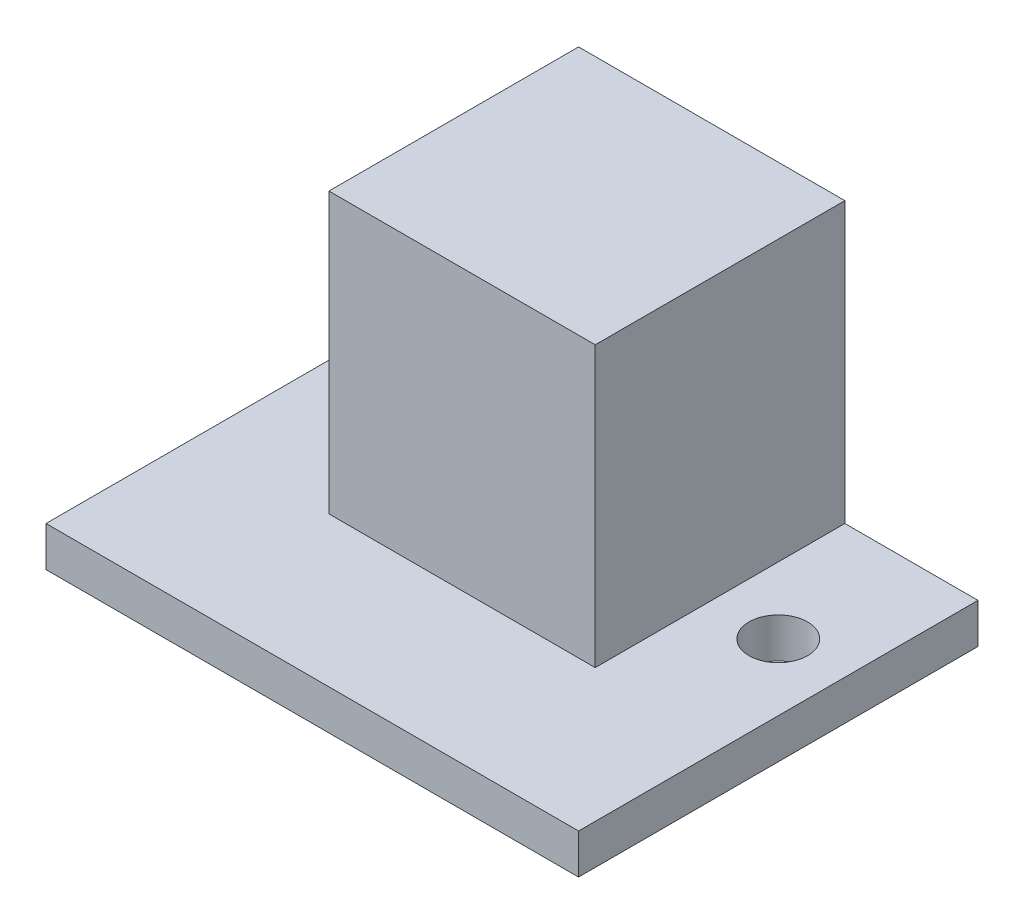
ISO-10303-21;
HEADER;
FILE_DESCRIPTION(('STEP AP214'),'2;1');
FILE_NAME('part.step','',(''),(''),'','','');
FILE_SCHEMA(('AUTOMOTIVE_DESIGN { 1 0 10303 214 1 1 1 1 }'));
ENDSEC;
DATA;
#1=APPLICATION_CONTEXT('core data for automotive mechanical design processes');
#2=APPLICATION_PROTOCOL_DEFINITION('international standard','automotive_design',2000,#1);
#3=PRODUCT_CONTEXT('',#1,'mechanical');
#4=PRODUCT('Part','Part','',(#3));
#5=PRODUCT_RELATED_PRODUCT_CATEGORY('part','',(#4));
#6=PRODUCT_DEFINITION_FORMATION('','',#4);
#7=PRODUCT_DEFINITION_CONTEXT('part definition',#1,'design');
#8=PRODUCT_DEFINITION('design','',#6,#7);
#9=PRODUCT_DEFINITION_SHAPE('','',#8);
#10=(LENGTH_UNIT() NAMED_UNIT(*) SI_UNIT(.MILLI.,.METRE.));
#11=(NAMED_UNIT(*) PLANE_ANGLE_UNIT() SI_UNIT($,.RADIAN.));
#12=(NAMED_UNIT(*) SI_UNIT($,.STERADIAN.) SOLID_ANGLE_UNIT());
#13=UNCERTAINTY_MEASURE_WITH_UNIT(LENGTH_MEASURE(1.E-05),#10,'distance_accuracy_value','');
#14=(GEOMETRIC_REPRESENTATION_CONTEXT(3) GLOBAL_UNCERTAINTY_ASSIGNED_CONTEXT((#13)) GLOBAL_UNIT_ASSIGNED_CONTEXT((#10,
#11,#12)) REPRESENTATION_CONTEXT('',''));
#15=CARTESIAN_POINT('',(0.,0.,0.));
#16=DIRECTION('',(0.,0.,1.));
#17=DIRECTION('',(1.,0.,0.));
#18=AXIS2_PLACEMENT_3D('',#15,#16,#17);
#19=CARTESIAN_POINT('',(0.,3.,-15.6296512348422));
#20=DIRECTION('',(0.,0.,-1.));
#21=DIRECTION('',(-1.,0.,0.));
#22=AXIS2_PLACEMENT_3D('',#19,#20,#21);
#23=PLANE('',#22);
#24=DIRECTION('',(1.,0.,0.));
#25=VECTOR('',#24,1.);
#26=CARTESIAN_POINT('',(0.,0.,-15.6296512348422));
#27=LINE('',#26,#25);
#28=CARTESIAN_POINT('',(-20.051649439755,0.,-15.6296512348422));
#29=VERTEX_POINT('',#28);
#30=CARTESIAN_POINT('',(19.948350560245,0.,-15.6296512348422));
#31=VERTEX_POINT('',#30);
#32=EDGE_CURVE('E137',#29,#31,#27,.T.);
#33=ORIENTED_EDGE('',*,*,#32,.F.);
#34=DIRECTION('',(0.,-1.,0.));
#35=VECTOR('',#34,1.);
#36=CARTESIAN_POINT('',(-20.051649439755,3.,-15.6296512348422));
#37=LINE('',#36,#35);
#38=CARTESIAN_POINT('',(-20.051649439755,3.,-15.6296512348422));
#39=VERTEX_POINT('',#38);
#40=EDGE_CURVE('E11',#39,#29,#37,.T.);
#41=ORIENTED_EDGE('',*,*,#40,.F.);
#42=DIRECTION('',(1.,0.,0.));
#43=VECTOR('',#42,1.);
#44=CARTESIAN_POINT('',(0.,3.,-15.6296512348422));
#45=LINE('',#44,#43);
#46=CARTESIAN_POINT('',(-10.051649439755,3.,-15.6296512348422));
#47=VERTEX_POINT('',#46);
#48=EDGE_CURVE('E138',#39,#47,#45,.T.);
#49=ORIENTED_EDGE('',*,*,#48,.T.);
#50=DIRECTION('',(0.,-1.,0.));
#51=VECTOR('',#50,1.);
#52=CARTESIAN_POINT('',(-10.051649439755,20.,-15.6296512348422));
#53=LINE('',#52,#51);
#54=CARTESIAN_POINT('',(-10.051649439755,24.,-15.6296512348422));
#55=VERTEX_POINT('',#54);
#56=EDGE_CURVE('E112',#55,#47,#53,.T.);
#57=ORIENTED_EDGE('',*,*,#56,.F.);
#58=DIRECTION('',(-1.,0.,0.));
#59=VECTOR('',#58,1.);
#60=CARTESIAN_POINT('',(-10.051649439755,24.,-15.6296512348422));
#61=LINE('',#60,#59);
#62=CARTESIAN_POINT('',(9.94835056024496,24.,-15.6296512348422));
#63=VERTEX_POINT('',#62);
#64=EDGE_CURVE('E115',#63,#55,#61,.T.);
#65=ORIENTED_EDGE('',*,*,#64,.F.);
#66=DIRECTION('',(0.,-1.,0.));
#67=VECTOR('',#66,1.);
#68=CARTESIAN_POINT('',(9.94835056024496,20.,-15.6296512348422));
#69=LINE('',#68,#67);
#70=CARTESIAN_POINT('',(9.94835056024496,3.,-15.6296512348422));
#71=VERTEX_POINT('',#70);
#72=EDGE_CURVE('E104',#63,#71,#69,.T.);
#73=ORIENTED_EDGE('',*,*,#72,.T.);
#74=CARTESIAN_POINT('',(19.948350560245,3.,-15.6296512348422));
#75=VERTEX_POINT('',#74);
#76=EDGE_CURVE('E58',#71,#75,#45,.T.);
#77=ORIENTED_EDGE('',*,*,#76,.T.);
#78=DIRECTION('',(0.,-1.,0.));
#79=VECTOR('',#78,1.);
#80=CARTESIAN_POINT('',(19.948350560245,3.,-15.6296512348422));
#81=LINE('',#80,#79);
#82=EDGE_CURVE('E76',#75,#31,#81,.T.);
#83=ORIENTED_EDGE('',*,*,#82,.T.);
#84=EDGE_LOOP('',(#33,#41,#49,#57,#65,#73,#77,#83));
#85=FACE_BOUND('',#84,.T.);
#86=ADVANCED_FACE('F35',(#85),#23,.T.);
#87=CARTESIAN_POINT('',(-20.051649439755,3.,0.));
#88=DIRECTION('',(1.,0.,0.));
#89=DIRECTION('',(0.,0.,-1.));
#90=AXIS2_PLACEMENT_3D('',#87,#88,#89);
#91=PLANE('',#90);
#92=DIRECTION('',(0.,0.,1.));
#93=VECTOR('',#92,1.);
#94=CARTESIAN_POINT('',(-20.051649439755,0.,0.));
#95=LINE('',#94,#93);
#96=CARTESIAN_POINT('',(-20.051649439755,0.,14.3703487651578));
#97=VERTEX_POINT('',#96);
#98=EDGE_CURVE('E154',#29,#97,#95,.T.);
#99=ORIENTED_EDGE('',*,*,#98,.T.);
#100=DIRECTION('',(0.,-1.,0.));
#101=VECTOR('',#100,1.);
#102=CARTESIAN_POINT('',(-20.051649439755,3.,14.3703487651578));
#103=LINE('',#102,#101);
#104=CARTESIAN_POINT('',(-20.051649439755,3.,14.3703487651578));
#105=VERTEX_POINT('',#104);
#106=EDGE_CURVE('E42',#105,#97,#103,.T.);
#107=ORIENTED_EDGE('',*,*,#106,.F.);
#108=DIRECTION('',(0.,0.,1.));
#109=VECTOR('',#108,1.);
#110=CARTESIAN_POINT('',(-20.051649439755,3.,0.));
#111=LINE('',#110,#109);
#112=EDGE_CURVE('E140',#39,#105,#111,.T.);
#113=ORIENTED_EDGE('',*,*,#112,.F.);
#114=ORIENTED_EDGE('',*,*,#40,.T.);
#115=EDGE_LOOP('',(#99,#107,#113,#114));
#116=FACE_BOUND('',#115,.T.);
#117=ADVANCED_FACE('F191',(#116),#91,.F.);
#118=CARTESIAN_POINT('',(0.,3.,14.3703487651578));
#119=DIRECTION('',(0.,0.,-1.));
#120=DIRECTION('',(-1.,0.,0.));
#121=AXIS2_PLACEMENT_3D('',#118,#119,#120);
#122=PLANE('',#121);
#123=DIRECTION('',(1.,0.,0.));
#124=VECTOR('',#123,1.);
#125=CARTESIAN_POINT('',(0.,0.,14.3703487651578));
#126=LINE('',#125,#124);
#127=CARTESIAN_POINT('',(19.948350560245,0.,14.3703487651578));
#128=VERTEX_POINT('',#127);
#129=EDGE_CURVE('E156',#97,#128,#126,.T.);
#130=ORIENTED_EDGE('',*,*,#129,.T.);
#131=DIRECTION('',(0.,-1.,0.));
#132=VECTOR('',#131,1.);
#133=CARTESIAN_POINT('',(19.948350560245,3.,14.3703487651578));
#134=LINE('',#133,#132);
#135=CARTESIAN_POINT('',(19.948350560245,3.,14.3703487651578));
#136=VERTEX_POINT('',#135);
#137=EDGE_CURVE('E169',#136,#128,#134,.T.);
#138=ORIENTED_EDGE('',*,*,#137,.F.);
#139=DIRECTION('',(1.,0.,0.));
#140=VECTOR('',#139,1.);
#141=CARTESIAN_POINT('',(0.,3.,14.3703487651578));
#142=LINE('',#141,#140);
#143=EDGE_CURVE('E142',#105,#136,#142,.T.);
#144=ORIENTED_EDGE('',*,*,#143,.F.);
#145=ORIENTED_EDGE('',*,*,#106,.T.);
#146=EDGE_LOOP('',(#130,#138,#144,#145));
#147=FACE_BOUND('',#146,.T.);
#148=ADVANCED_FACE('F175',(#147),#122,.F.);
#149=CARTESIAN_POINT('',(-15.051649439755,3.,-5.62965123484221));
#150=DIRECTION('',(0.,-1.,0.));
#151=DIRECTION('',(0.,0.,-1.));
#152=AXIS2_PLACEMENT_3D('',#149,#150,#151);
#153=CYLINDRICAL_SURFACE('',#152,2.2);
#154=CARTESIAN_POINT('',(-15.051649439755,3.,-5.62965123484221));
#155=DIRECTION('',(0.,1.,0.));
#156=DIRECTION('',(0.,0.,1.));
#157=AXIS2_PLACEMENT_3D('',#154,#155,#156);
#158=CIRCLE('',#157,2.2);
#159=CARTESIAN_POINT('',(-15.051649439755,3.,-3.42965123484221));
#160=VERTEX_POINT('',#159);
#161=EDGE_CURVE('E147',#160,#160,#158,.T.);
#162=ORIENTED_EDGE('',*,*,#161,.T.);
#163=EDGE_LOOP('',(#162));
#164=FACE_BOUND('',#163,.T.);
#165=CARTESIAN_POINT('',(-15.051649439755,0.,-5.62965123484221));
#166=DIRECTION('',(0.,1.,0.));
#167=DIRECTION('',(0.,0.,1.));
#168=AXIS2_PLACEMENT_3D('',#165,#166,#167);
#169=CIRCLE('',#168,2.2);
#170=CARTESIAN_POINT('',(-15.051649439755,0.,-3.42965123484221));
#171=VERTEX_POINT('',#170);
#172=EDGE_CURVE('E162',#171,#171,#169,.T.);
#173=ORIENTED_EDGE('',*,*,#172,.F.);
#174=EDGE_LOOP('',(#173));
#175=FACE_BOUND('',#174,.T.);
#176=ADVANCED_FACE('F197',(#164,#175),#153,.F.);
#177=CARTESIAN_POINT('',(19.948350560245,3.,0.));
#178=DIRECTION('',(1.,0.,0.));
#179=DIRECTION('',(0.,0.,-1.));
#180=AXIS2_PLACEMENT_3D('',#177,#178,#179);
#181=PLANE('',#180);
#182=DIRECTION('',(0.,0.,1.));
#183=VECTOR('',#182,1.);
#184=CARTESIAN_POINT('',(19.948350560245,0.,0.));
#185=LINE('',#184,#183);
#186=EDGE_CURVE('E159',#31,#128,#185,.T.);
#187=ORIENTED_EDGE('',*,*,#186,.F.);
#188=ORIENTED_EDGE('',*,*,#82,.F.);
#189=DIRECTION('',(0.,0.,1.));
#190=VECTOR('',#189,1.);
#191=CARTESIAN_POINT('',(19.948350560245,3.,0.));
#192=LINE('',#191,#190);
#193=EDGE_CURVE('E144',#75,#136,#192,.T.);
#194=ORIENTED_EDGE('',*,*,#193,.T.);
#195=ORIENTED_EDGE('',*,*,#137,.T.);
#196=EDGE_LOOP('',(#187,#188,#194,#195));
#197=FACE_BOUND('',#196,.T.);
#198=ADVANCED_FACE('F184',(#197),#181,.T.);
#199=CARTESIAN_POINT('',(14.948350560245,3.,-5.62965123484221));
#200=DIRECTION('',(0.,-1.,0.));
#201=DIRECTION('',(0.,0.,-1.));
#202=AXIS2_PLACEMENT_3D('',#199,#200,#201);
#203=CYLINDRICAL_SURFACE('',#202,2.2);
#204=CARTESIAN_POINT('',(14.948350560245,3.,-5.62965123484221));
#205=DIRECTION('',(0.,1.,0.));
#206=DIRECTION('',(0.,0.,1.));
#207=AXIS2_PLACEMENT_3D('',#204,#205,#206);
#208=CIRCLE('',#207,2.2);
#209=CARTESIAN_POINT('',(14.948350560245,3.,-3.42965123484221));
#210=VERTEX_POINT('',#209);
#211=EDGE_CURVE('E150',#210,#210,#208,.T.);
#212=ORIENTED_EDGE('',*,*,#211,.T.);
#213=EDGE_LOOP('',(#212));
#214=FACE_BOUND('',#213,.T.);
#215=CARTESIAN_POINT('',(14.948350560245,0.,-5.62965123484221));
#216=DIRECTION('',(0.,1.,0.));
#217=DIRECTION('',(0.,0.,1.));
#218=AXIS2_PLACEMENT_3D('',#215,#216,#217);
#219=CIRCLE('',#218,2.2);
#220=CARTESIAN_POINT('',(14.948350560245,0.,-3.42965123484221));
#221=VERTEX_POINT('',#220);
#222=EDGE_CURVE('E165',#221,#221,#219,.T.);
#223=ORIENTED_EDGE('',*,*,#222,.F.);
#224=EDGE_LOOP('',(#223));
#225=FACE_BOUND('',#224,.T.);
#226=ADVANCED_FACE('F202',(#214,#225),#203,.F.);
#227=CARTESIAN_POINT('',(0.,3.,0.));
#228=DIRECTION('',(0.,1.,0.));
#229=DIRECTION('',(0.,0.,1.));
#230=AXIS2_PLACEMENT_3D('',#227,#228,#229);
#231=PLANE('',#230);
#232=DIRECTION('',(0.,0.,1.));
#233=VECTOR('',#232,1.);
#234=CARTESIAN_POINT('',(-10.051649439755,3.,0.));
#235=LINE('',#234,#233);
#236=CARTESIAN_POINT('',(-10.051649439755,3.,3.12034876515778));
#237=VERTEX_POINT('',#236);
#238=EDGE_CURVE('E131',#47,#237,#235,.T.);
#239=ORIENTED_EDGE('',*,*,#238,.F.);
#240=ORIENTED_EDGE('',*,*,#48,.F.);
#241=ORIENTED_EDGE('',*,*,#112,.T.);
#242=ORIENTED_EDGE('',*,*,#143,.T.);
#243=ORIENTED_EDGE('',*,*,#193,.F.);
#244=ORIENTED_EDGE('',*,*,#76,.F.);
#245=DIRECTION('',(0.,0.,1.));
#246=VECTOR('',#245,1.);
#247=CARTESIAN_POINT('',(9.94835056024495,3.,0.));
#248=LINE('',#247,#246);
#249=CARTESIAN_POINT('',(9.94835056024495,3.,3.12034876515778));
#250=VERTEX_POINT('',#249);
#251=EDGE_CURVE('E110',#71,#250,#248,.T.);
#252=ORIENTED_EDGE('',*,*,#251,.T.);
#253=DIRECTION('',(1.,0.,0.));
#254=VECTOR('',#253,1.);
#255=CARTESIAN_POINT('',(0.,3.,3.12034876515778));
#256=LINE('',#255,#254);
#257=EDGE_CURVE('E49',#237,#250,#256,.T.);
#258=ORIENTED_EDGE('',*,*,#257,.F.);
#259=EDGE_LOOP('',(#239,#240,#241,#242,#243,#244,#252,#258));
#260=FACE_BOUND('',#259,.T.);
#261=ORIENTED_EDGE('',*,*,#161,.F.);
#262=EDGE_LOOP('',(#261));
#263=FACE_BOUND('',#262,.T.);
#264=ORIENTED_EDGE('',*,*,#211,.F.);
#265=EDGE_LOOP('',(#264));
#266=FACE_BOUND('',#265,.T.);
#267=ADVANCED_FACE('F188',(#260,#263,#266),#231,.T.);
#268=CARTESIAN_POINT('',(0.,0.,0.));
#269=DIRECTION('',(0.,1.,0.));
#270=DIRECTION('',(0.,0.,1.));
#271=AXIS2_PLACEMENT_3D('',#268,#269,#270);
#272=PLANE('',#271);
#273=ORIENTED_EDGE('',*,*,#32,.T.);
#274=ORIENTED_EDGE('',*,*,#186,.T.);
#275=ORIENTED_EDGE('',*,*,#129,.F.);
#276=ORIENTED_EDGE('',*,*,#98,.F.);
#277=EDGE_LOOP('',(#273,#274,#275,#276));
#278=FACE_BOUND('',#277,.T.);
#279=ORIENTED_EDGE('',*,*,#172,.T.);
#280=EDGE_LOOP('',(#279));
#281=FACE_BOUND('',#280,.T.);
#282=ORIENTED_EDGE('',*,*,#222,.T.);
#283=EDGE_LOOP('',(#282));
#284=FACE_BOUND('',#283,.T.);
#285=ADVANCED_FACE('F180',(#278,#281,#284),#272,.F.);
#286=CARTESIAN_POINT('',(0.,20.,3.12034876515778));
#287=DIRECTION('',(0.,0.,-1.));
#288=DIRECTION('',(-1.,0.,0.));
#289=AXIS2_PLACEMENT_3D('',#286,#287,#288);
#290=PLANE('',#289);
#291=ORIENTED_EDGE('',*,*,#257,.T.);
#292=DIRECTION('',(0.,-1.,0.));
#293=VECTOR('',#292,1.);
#294=CARTESIAN_POINT('',(9.94835056024495,20.,3.12034876515778));
#295=LINE('',#294,#293);
#296=CARTESIAN_POINT('',(9.94835056024495,24.,3.12034876515778));
#297=VERTEX_POINT('',#296);
#298=EDGE_CURVE('E111',#297,#250,#295,.T.);
#299=ORIENTED_EDGE('',*,*,#298,.F.);
#300=DIRECTION('',(1.,0.,0.));
#301=VECTOR('',#300,1.);
#302=CARTESIAN_POINT('',(9.94835056024495,24.,3.12034876515778));
#303=LINE('',#302,#301);
#304=CARTESIAN_POINT('',(-10.051649439755,24.,3.12034876515778));
#305=VERTEX_POINT('',#304);
#306=EDGE_CURVE('E124',#305,#297,#303,.T.);
#307=ORIENTED_EDGE('',*,*,#306,.F.);
#308=DIRECTION('',(0.,-1.,0.));
#309=VECTOR('',#308,1.);
#310=CARTESIAN_POINT('',(-10.051649439755,20.,3.12034876515778));
#311=LINE('',#310,#309);
#312=EDGE_CURVE('E133',#305,#237,#311,.T.);
#313=ORIENTED_EDGE('',*,*,#312,.T.);
#314=EDGE_LOOP('',(#291,#299,#307,#313));
#315=FACE_BOUND('',#314,.T.);
#316=ADVANCED_FACE('F211',(#315),#290,.F.);
#317=CARTESIAN_POINT('',(9.94835056024495,20.,0.));
#318=DIRECTION('',(1.,0.,0.));
#319=DIRECTION('',(0.,0.,-1.));
#320=AXIS2_PLACEMENT_3D('',#317,#318,#319);
#321=PLANE('',#320);
#322=ORIENTED_EDGE('',*,*,#251,.F.);
#323=ORIENTED_EDGE('',*,*,#72,.F.);
#324=DIRECTION('',(0.,0.,-1.));
#325=VECTOR('',#324,1.);
#326=CARTESIAN_POINT('',(9.94835056024496,24.,-15.6296512348422));
#327=LINE('',#326,#325);
#328=EDGE_CURVE('E108',#297,#63,#327,.T.);
#329=ORIENTED_EDGE('',*,*,#328,.F.);
#330=ORIENTED_EDGE('',*,*,#298,.T.);
#331=EDGE_LOOP('',(#322,#323,#329,#330));
#332=FACE_BOUND('',#331,.T.);
#333=ADVANCED_FACE('F106',(#332),#321,.T.);
#334=CARTESIAN_POINT('',(-10.051649439755,20.,0.));
#335=DIRECTION('',(1.,0.,0.));
#336=DIRECTION('',(0.,0.,-1.));
#337=AXIS2_PLACEMENT_3D('',#334,#335,#336);
#338=PLANE('',#337);
#339=ORIENTED_EDGE('',*,*,#238,.T.);
#340=ORIENTED_EDGE('',*,*,#312,.F.);
#341=DIRECTION('',(0.,0.,1.));
#342=VECTOR('',#341,1.);
#343=CARTESIAN_POINT('',(-10.051649439755,24.,3.12034876515778));
#344=LINE('',#343,#342);
#345=EDGE_CURVE('E119',#55,#305,#344,.T.);
#346=ORIENTED_EDGE('',*,*,#345,.F.);
#347=ORIENTED_EDGE('',*,*,#56,.T.);
#348=EDGE_LOOP('',(#339,#340,#346,#347));
#349=FACE_BOUND('',#348,.T.);
#350=ADVANCED_FACE('F218',(#349),#338,.F.);
#351=CARTESIAN_POINT('',(0.,24.,0.));
#352=DIRECTION('',(0.,-1.,0.));
#353=DIRECTION('',(0.,0.,-1.));
#354=AXIS2_PLACEMENT_3D('',#351,#352,#353);
#355=PLANE('',#354);
#356=ORIENTED_EDGE('',*,*,#328,.T.);
#357=ORIENTED_EDGE('',*,*,#64,.T.);
#358=ORIENTED_EDGE('',*,*,#345,.T.);
#359=ORIENTED_EDGE('',*,*,#306,.T.);
#360=EDGE_LOOP('',(#356,#357,#358,#359));
#361=FACE_BOUND('',#360,.T.);
#362=ADVANCED_FACE('F122',(#361),#355,.F.);
#363=CLOSED_SHELL('',(#86,#117,#148,#176,#198,#226,#267,#285,#316,#333,#350,#362));
#364=MANIFOLD_SOLID_BREP('B2',#363);
#365=ADVANCED_BREP_SHAPE_REPRESENTATION('',(#18,#364),#14);
#366=SHAPE_DEFINITION_REPRESENTATION(#9,#365);
ENDSEC;
END-ISO-10303-21;
